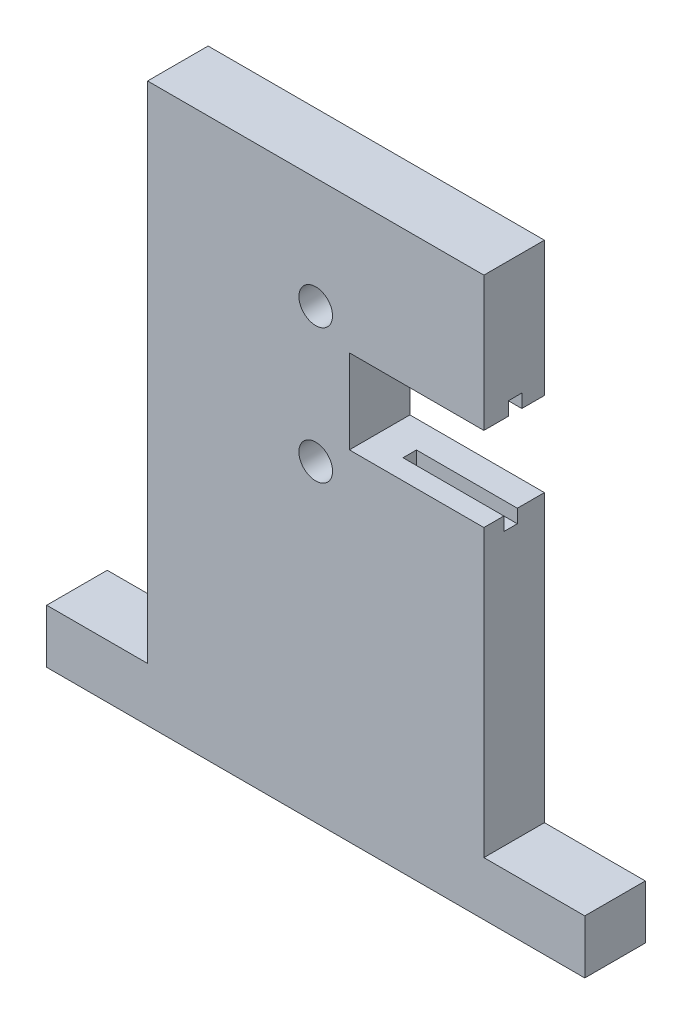
ISO-10303-21;
HEADER;
FILE_DESCRIPTION(('STEP AP214'),'2;1');
FILE_NAME('part.step','',(''),(''),'','','');
FILE_SCHEMA(('AUTOMOTIVE_DESIGN { 1 0 10303 214 1 1 1 1 }'));
ENDSEC;
DATA;
#1=APPLICATION_CONTEXT('core data for automotive mechanical design processes');
#2=APPLICATION_PROTOCOL_DEFINITION('international standard','automotive_design',2000,#1);
#3=PRODUCT_CONTEXT('',#1,'mechanical');
#4=PRODUCT('Part','Part','',(#3));
#5=PRODUCT_RELATED_PRODUCT_CATEGORY('part','',(#4));
#6=PRODUCT_DEFINITION_FORMATION('','',#4);
#7=PRODUCT_DEFINITION_CONTEXT('part definition',#1,'design');
#8=PRODUCT_DEFINITION('design','',#6,#7);
#9=PRODUCT_DEFINITION_SHAPE('','',#8);
#10=(LENGTH_UNIT() NAMED_UNIT(*) SI_UNIT(.MILLI.,.METRE.));
#11=(NAMED_UNIT(*) PLANE_ANGLE_UNIT() SI_UNIT($,.RADIAN.));
#12=(NAMED_UNIT(*) SI_UNIT($,.STERADIAN.) SOLID_ANGLE_UNIT());
#13=UNCERTAINTY_MEASURE_WITH_UNIT(LENGTH_MEASURE(1.E-05),#10,'distance_accuracy_value','');
#14=(GEOMETRIC_REPRESENTATION_CONTEXT(3) GLOBAL_UNCERTAINTY_ASSIGNED_CONTEXT((#13)) GLOBAL_UNIT_ASSIGNED_CONTEXT((#10,
#11,#12)) REPRESENTATION_CONTEXT('',''));
#15=CARTESIAN_POINT('',(0.,0.,0.));
#16=DIRECTION('',(0.,0.,1.));
#17=DIRECTION('',(1.,0.,0.));
#18=AXIS2_PLACEMENT_3D('',#15,#16,#17);
#19=CARTESIAN_POINT('',(66.5532367821157,8.,-9.));
#20=DIRECTION('',(1.,0.,0.));
#21=DIRECTION('',(0.,1.,0.));
#22=AXIS2_PLACEMENT_3D('',#19,#20,#21);
#23=PLANE('',#22);
#24=DIRECTION('',(0.,0.,1.));
#25=VECTOR('',#24,1.);
#26=CARTESIAN_POINT('',(66.5532367821157,63.0000000000001,-9.));
#27=LINE('',#26,#25);
#28=CARTESIAN_POINT('',(66.5532367821157,63.0000000000001,-3.63865081511494));
#29=VERTEX_POINT('',#28);
#30=CARTESIAN_POINT('',(66.5532367821157,63.0000000000001,0.));
#31=VERTEX_POINT('',#30);
#32=EDGE_CURVE('E191',#29,#31,#27,.T.);
#33=ORIENTED_EDGE('',*,*,#32,.F.);
#34=DIRECTION('',(0.,-1.,0.));
#35=VECTOR('',#34,1.);
#36=CARTESIAN_POINT('',(66.5532367821157,65.0000000000001,-3.63865081511494));
#37=LINE('',#36,#35);
#38=CARTESIAN_POINT('',(66.5532367821157,65.0000000000001,-3.63865081511494));
#39=VERTEX_POINT('',#38);
#40=EDGE_CURVE('E185',#39,#29,#37,.T.);
#41=ORIENTED_EDGE('',*,*,#40,.F.);
#42=DIRECTION('',(0.,0.,-1.));
#43=VECTOR('',#42,1.);
#44=CARTESIAN_POINT('',(66.5532367821157,65.0000000000001,-3.63865081511494));
#45=LINE('',#44,#43);
#46=CARTESIAN_POINT('',(66.5532367821157,65.0000000000001,-5.63865081511494));
#47=VERTEX_POINT('',#46);
#48=EDGE_CURVE('E174',#39,#47,#45,.T.);
#49=ORIENTED_EDGE('',*,*,#48,.T.);
#50=DIRECTION('',(0.,-1.,0.));
#51=VECTOR('',#50,1.);
#52=CARTESIAN_POINT('',(66.5532367821157,65.0000000000001,-5.63865081511494));
#53=LINE('',#52,#51);
#54=CARTESIAN_POINT('',(66.5532367821157,63.0000000000001,-5.63865081511494));
#55=VERTEX_POINT('',#54);
#56=EDGE_CURVE('E192',#47,#55,#53,.T.);
#57=ORIENTED_EDGE('',*,*,#56,.T.);
#58=CARTESIAN_POINT('',(66.5532367821157,63.0000000000001,-9.));
#59=VERTEX_POINT('',#58);
#60=EDGE_CURVE('E229',#59,#55,#27,.T.);
#61=ORIENTED_EDGE('',*,*,#60,.F.);
#62=DIRECTION('',(0.,1.,0.));
#63=VECTOR('',#62,1.);
#64=CARTESIAN_POINT('',(66.5532367821157,8.,-9.));
#65=LINE('',#64,#63);
#66=CARTESIAN_POINT('',(66.5532367821157,83.0000000000001,-9.));
#67=VERTEX_POINT('',#66);
#68=EDGE_CURVE('E278',#59,#67,#65,.T.);
#69=ORIENTED_EDGE('',*,*,#68,.T.);
#70=DIRECTION('',(0.,0.,1.));
#71=VECTOR('',#70,1.);
#72=CARTESIAN_POINT('',(66.5532367821157,83.0000000000001,-9.));
#73=LINE('',#72,#71);
#74=CARTESIAN_POINT('',(66.5532367821157,83.0000000000001,0.));
#75=VERTEX_POINT('',#74);
#76=EDGE_CURVE('E317',#67,#75,#73,.T.);
#77=ORIENTED_EDGE('',*,*,#76,.T.);
#78=DIRECTION('',(0.,1.,0.));
#79=VECTOR('',#78,1.);
#80=CARTESIAN_POINT('',(66.5532367821157,8.,0.));
#81=LINE('',#80,#79);
#82=EDGE_CURVE('E302',#31,#75,#81,.T.);
#83=ORIENTED_EDGE('',*,*,#82,.F.);
#84=EDGE_LOOP('',(#33,#41,#49,#57,#61,#69,#77,#83));
#85=FACE_BOUND('',#84,.T.);
#86=ADVANCED_FACE('F33',(#85),#23,.T.);
#87=CARTESIAN_POINT('',(46.5532367821157,63.0000000000001,-9.));
#88=DIRECTION('',(0.,1.,0.));
#89=DIRECTION('',(-1.,0.,0.));
#90=AXIS2_PLACEMENT_3D('',#87,#88,#89);
#91=PLANE('',#90);
#92=DIRECTION('',(1.,0.,0.));
#93=VECTOR('',#92,1.);
#94=CARTESIAN_POINT('',(51.5532367821157,63.0000000000001,-3.63865081511494));
#95=LINE('',#94,#93);
#96=CARTESIAN_POINT('',(51.5532367821157,63.0000000000001,-3.63865081511494));
#97=VERTEX_POINT('',#96);
#98=EDGE_CURVE('E50',#97,#29,#95,.T.);
#99=ORIENTED_EDGE('',*,*,#98,.T.);
#100=ORIENTED_EDGE('',*,*,#32,.T.);
#101=DIRECTION('',(1.,0.,0.));
#102=VECTOR('',#101,1.);
#103=CARTESIAN_POINT('',(46.5532367821157,63.0000000000001,0.));
#104=LINE('',#103,#102);
#105=CARTESIAN_POINT('',(46.5532367821157,63.0000000000001,0.));
#106=VERTEX_POINT('',#105);
#107=EDGE_CURVE('E243',#106,#31,#104,.T.);
#108=ORIENTED_EDGE('',*,*,#107,.F.);
#109=DIRECTION('',(0.,0.,1.));
#110=VECTOR('',#109,1.);
#111=CARTESIAN_POINT('',(46.5532367821157,63.0000000000001,-9.));
#112=LINE('',#111,#110);
#113=CARTESIAN_POINT('',(46.5532367821157,63.0000000000001,-9.));
#114=VERTEX_POINT('',#113);
#115=EDGE_CURVE('E234',#114,#106,#112,.T.);
#116=ORIENTED_EDGE('',*,*,#115,.F.);
#117=DIRECTION('',(1.,0.,0.));
#118=VECTOR('',#117,1.);
#119=CARTESIAN_POINT('',(46.5532367821157,63.0000000000001,-9.));
#120=LINE('',#119,#118);
#121=EDGE_CURVE('E236',#114,#59,#120,.T.);
#122=ORIENTED_EDGE('',*,*,#121,.T.);
#123=ORIENTED_EDGE('',*,*,#60,.T.);
#124=DIRECTION('',(-1.,0.,0.));
#125=VECTOR('',#124,1.);
#126=CARTESIAN_POINT('',(66.5532367821157,63.0000000000001,-5.63865081511494));
#127=LINE('',#126,#125);
#128=CARTESIAN_POINT('',(51.5532367821157,63.0000000000001,-5.63865081511495));
#129=VERTEX_POINT('',#128);
#130=EDGE_CURVE('E369',#55,#129,#127,.T.);
#131=ORIENTED_EDGE('',*,*,#130,.T.);
#132=DIRECTION('',(0.,0.,1.));
#133=VECTOR('',#132,1.);
#134=CARTESIAN_POINT('',(51.5532367821157,63.0000000000001,-5.63865081511495));
#135=LINE('',#134,#133);
#136=EDGE_CURVE('E187',#129,#97,#135,.T.);
#137=ORIENTED_EDGE('',*,*,#136,.T.);
#138=EDGE_LOOP('',(#99,#100,#108,#116,#122,#123,#131,#137));
#139=FACE_BOUND('',#138,.T.);
#140=ADVANCED_FACE('F365',(#139),#91,.F.);
#141=DIRECTION('',(0.,0.,1.));
#142=VECTOR('',#141,1.);
#143=CARTESIAN_POINT('',(66.5532367821157,50.5000000000001,-9.));
#144=LINE('',#143,#142);
#145=CARTESIAN_POINT('',(66.5532367821157,50.5000000000001,-9.));
#146=VERTEX_POINT('',#145);
#147=CARTESIAN_POINT('',(66.5532367821157,50.5000000000001,-4.97376514653536));
#148=VERTEX_POINT('',#147);
#149=EDGE_CURVE('E237',#146,#148,#144,.T.);
#150=ORIENTED_EDGE('',*,*,#149,.T.);
#151=DIRECTION('',(0.,1.,0.));
#152=VECTOR('',#151,1.);
#153=CARTESIAN_POINT('',(66.5532367821157,48.5000000000001,-4.97376514653536));
#154=LINE('',#153,#152);
#155=CARTESIAN_POINT('',(66.5532367821157,48.5000000000001,-4.97376514653536));
#156=VERTEX_POINT('',#155);
#157=EDGE_CURVE('E222',#156,#148,#154,.T.);
#158=ORIENTED_EDGE('',*,*,#157,.F.);
#159=DIRECTION('',(0.,0.,1.));
#160=VECTOR('',#159,1.);
#161=CARTESIAN_POINT('',(66.5532367821157,48.5000000000001,-4.97376514653536));
#162=LINE('',#161,#160);
#163=CARTESIAN_POINT('',(66.5532367821157,48.5000000000001,-2.97376514653536));
#164=VERTEX_POINT('',#163);
#165=EDGE_CURVE('E203',#156,#164,#162,.T.);
#166=ORIENTED_EDGE('',*,*,#165,.T.);
#167=DIRECTION('',(0.,1.,0.));
#168=VECTOR('',#167,1.);
#169=CARTESIAN_POINT('',(66.5532367821157,48.5000000000001,-2.97376514653536));
#170=LINE('',#169,#168);
#171=CARTESIAN_POINT('',(66.5532367821157,50.5000000000001,-2.97376514653536));
#172=VERTEX_POINT('',#171);
#173=EDGE_CURVE('E219',#164,#172,#170,.T.);
#174=ORIENTED_EDGE('',*,*,#173,.T.);
#175=CARTESIAN_POINT('',(66.5532367821157,50.5000000000001,0.));
#176=VERTEX_POINT('',#175);
#177=EDGE_CURVE('E224',#172,#176,#144,.T.);
#178=ORIENTED_EDGE('',*,*,#177,.T.);
#179=CARTESIAN_POINT('',(66.5532367821157,8.,0.));
#180=VERTEX_POINT('',#179);
#181=EDGE_CURVE('E303',#180,#176,#81,.T.);
#182=ORIENTED_EDGE('',*,*,#181,.F.);
#183=DIRECTION('',(0.,0.,1.));
#184=VECTOR('',#183,1.);
#185=CARTESIAN_POINT('',(66.5532367821157,8.,-9.));
#186=LINE('',#185,#184);
#187=CARTESIAN_POINT('',(66.5532367821157,8.,-9.));
#188=VERTEX_POINT('',#187);
#189=EDGE_CURVE('E320',#188,#180,#186,.T.);
#190=ORIENTED_EDGE('',*,*,#189,.F.);
#191=EDGE_CURVE('E279',#188,#146,#65,.T.);
#192=ORIENTED_EDGE('',*,*,#191,.T.);
#193=EDGE_LOOP('',(#150,#158,#166,#174,#178,#182,#190,#192));
#194=FACE_BOUND('',#193,.T.);
#195=ADVANCED_FACE('F353',(#194),#23,.T.);
#196=CARTESIAN_POINT('',(46.5532367821157,50.5000000000001,-9.));
#197=DIRECTION('',(0.,1.,0.));
#198=DIRECTION('',(-1.,0.,0.));
#199=AXIS2_PLACEMENT_3D('',#196,#197,#198);
#200=PLANE('',#199);
#201=DIRECTION('',(0.,0.,-1.));
#202=VECTOR('',#201,1.);
#203=CARTESIAN_POINT('',(51.5532367821157,50.5000000000001,-2.97376514653536));
#204=LINE('',#203,#202);
#205=CARTESIAN_POINT('',(51.5532367821157,50.5000000000001,-2.97376514653536));
#206=VERTEX_POINT('',#205);
#207=CARTESIAN_POINT('',(51.5532367821157,50.5000000000001,-4.97376514653536));
#208=VERTEX_POINT('',#207);
#209=EDGE_CURVE('E204',#206,#208,#204,.T.);
#210=ORIENTED_EDGE('',*,*,#209,.T.);
#211=DIRECTION('',(1.,0.,0.));
#212=VECTOR('',#211,1.);
#213=CARTESIAN_POINT('',(51.5532367821157,50.5000000000001,-4.97376514653536));
#214=LINE('',#213,#212);
#215=EDGE_CURVE('E58',#208,#148,#214,.T.);
#216=ORIENTED_EDGE('',*,*,#215,.T.);
#217=ORIENTED_EDGE('',*,*,#149,.F.);
#218=DIRECTION('',(1.,0.,0.));
#219=VECTOR('',#218,1.);
#220=CARTESIAN_POINT('',(46.5532367821157,50.5000000000001,-9.));
#221=LINE('',#220,#219);
#222=CARTESIAN_POINT('',(46.5532367821157,50.5000000000001,-9.));
#223=VERTEX_POINT('',#222);
#224=EDGE_CURVE('E249',#223,#146,#221,.T.);
#225=ORIENTED_EDGE('',*,*,#224,.F.);
#226=DIRECTION('',(0.,0.,1.));
#227=VECTOR('',#226,1.);
#228=CARTESIAN_POINT('',(46.5532367821157,50.5000000000001,-9.));
#229=LINE('',#228,#227);
#230=CARTESIAN_POINT('',(46.5532367821157,50.5000000000001,0.));
#231=VERTEX_POINT('',#230);
#232=EDGE_CURVE('E228',#223,#231,#229,.T.);
#233=ORIENTED_EDGE('',*,*,#232,.T.);
#234=DIRECTION('',(1.,0.,0.));
#235=VECTOR('',#234,1.);
#236=CARTESIAN_POINT('',(46.5532367821157,50.5000000000001,0.));
#237=LINE('',#236,#235);
#238=EDGE_CURVE('E246',#231,#176,#237,.T.);
#239=ORIENTED_EDGE('',*,*,#238,.T.);
#240=ORIENTED_EDGE('',*,*,#177,.F.);
#241=DIRECTION('',(-1.,0.,0.));
#242=VECTOR('',#241,1.);
#243=CARTESIAN_POINT('',(66.5532367821157,50.5000000000001,-2.97376514653536));
#244=LINE('',#243,#242);
#245=EDGE_CURVE('E194',#172,#206,#244,.T.);
#246=ORIENTED_EDGE('',*,*,#245,.T.);
#247=EDGE_LOOP('',(#210,#216,#217,#225,#233,#239,#240,#246));
#248=FACE_BOUND('',#247,.T.);
#249=ADVANCED_FACE('F356',(#248),#200,.T.);
#250=CARTESIAN_POINT('',(0.,0.,-9.));
#251=DIRECTION('',(0.,0.,1.));
#252=DIRECTION('',(1.,0.,0.));
#253=AXIS2_PLACEMENT_3D('',#250,#251,#252);
#254=PLANE('',#253);
#255=CARTESIAN_POINT('',(41.5532367821157,46.5,-9.));
#256=DIRECTION('',(0.,0.,1.));
#257=DIRECTION('',(1.,0.,0.));
#258=AXIS2_PLACEMENT_3D('',#255,#256,#257);
#259=CIRCLE('',#258,2.5);
#260=CARTESIAN_POINT('',(44.0532367821157,46.5,-9.));
#261=VERTEX_POINT('',#260);
#262=EDGE_CURVE('E259',#261,#261,#259,.T.);
#263=ORIENTED_EDGE('',*,*,#262,.T.);
#264=EDGE_LOOP('',(#263));
#265=FACE_BOUND('',#264,.T.);
#266=CARTESIAN_POINT('',(41.5532367821157,66.5,-9.));
#267=DIRECTION('',(0.,0.,1.));
#268=DIRECTION('',(1.,0.,0.));
#269=AXIS2_PLACEMENT_3D('',#266,#267,#268);
#270=CIRCLE('',#269,2.5);
#271=CARTESIAN_POINT('',(44.0532367821157,66.5,-9.));
#272=VERTEX_POINT('',#271);
#273=EDGE_CURVE('E253',#272,#272,#270,.T.);
#274=ORIENTED_EDGE('',*,*,#273,.T.);
#275=EDGE_LOOP('',(#274));
#276=FACE_BOUND('',#275,.T.);
#277=ORIENTED_EDGE('',*,*,#224,.T.);
#278=ORIENTED_EDGE('',*,*,#191,.F.);
#279=DIRECTION('',(-1.,0.,0.));
#280=VECTOR('',#279,1.);
#281=CARTESIAN_POINT('',(81.5532367821157,8.,-9.));
#282=LINE('',#281,#280);
#283=CARTESIAN_POINT('',(81.5532367821157,8.,-9.));
#284=VERTEX_POINT('',#283);
#285=EDGE_CURVE('E275',#284,#188,#282,.T.);
#286=ORIENTED_EDGE('',*,*,#285,.F.);
#287=DIRECTION('',(0.,1.,0.));
#288=VECTOR('',#287,1.);
#289=CARTESIAN_POINT('',(81.5532367821157,0.,-9.));
#290=LINE('',#289,#288);
#291=CARTESIAN_POINT('',(81.5532367821157,0.,-9.));
#292=VERTEX_POINT('',#291);
#293=EDGE_CURVE('E272',#292,#284,#290,.T.);
#294=ORIENTED_EDGE('',*,*,#293,.F.);
#295=DIRECTION('',(1.,0.,0.));
#296=VECTOR('',#295,1.);
#297=CARTESIAN_POINT('',(1.55323678211589,1.11022302462516E-13,-9.));
#298=LINE('',#297,#296);
#299=CARTESIAN_POINT('',(1.55323678211589,1.11022302462516E-13,-9.));
#300=VERTEX_POINT('',#299);
#301=EDGE_CURVE('E268',#300,#292,#298,.T.);
#302=ORIENTED_EDGE('',*,*,#301,.F.);
#303=DIRECTION('',(0.,-1.,0.));
#304=VECTOR('',#303,1.);
#305=CARTESIAN_POINT('',(1.55323678211588,8.00000000000011,-9.));
#306=LINE('',#305,#304);
#307=CARTESIAN_POINT('',(1.55323678211588,8.00000000000011,-9.));
#308=VERTEX_POINT('',#307);
#309=EDGE_CURVE('E265',#308,#300,#306,.T.);
#310=ORIENTED_EDGE('',*,*,#309,.F.);
#311=DIRECTION('',(-1.,0.,0.));
#312=VECTOR('',#311,1.);
#313=CARTESIAN_POINT('',(16.5532367821159,8.00000000000011,-9.));
#314=LINE('',#313,#312);
#315=CARTESIAN_POINT('',(16.5532367821159,8.00000000000011,-9.));
#316=VERTEX_POINT('',#315);
#317=EDGE_CURVE('E288',#316,#308,#314,.T.);
#318=ORIENTED_EDGE('',*,*,#317,.F.);
#319=DIRECTION('',(0.,-1.,0.));
#320=VECTOR('',#319,1.);
#321=CARTESIAN_POINT('',(16.5532367821159,83.0000000000001,-9.));
#322=LINE('',#321,#320);
#323=CARTESIAN_POINT('',(16.5532367821159,83.0000000000001,-9.));
#324=VERTEX_POINT('',#323);
#325=EDGE_CURVE('E285',#324,#316,#322,.T.);
#326=ORIENTED_EDGE('',*,*,#325,.F.);
#327=DIRECTION('',(-1.,0.,0.));
#328=VECTOR('',#327,1.);
#329=CARTESIAN_POINT('',(66.5532367821157,83.0000000000001,-9.));
#330=LINE('',#329,#328);
#331=EDGE_CURVE('E282',#67,#324,#330,.T.);
#332=ORIENTED_EDGE('',*,*,#331,.F.);
#333=ORIENTED_EDGE('',*,*,#68,.F.);
#334=ORIENTED_EDGE('',*,*,#121,.F.);
#335=DIRECTION('',(0.,-1.,0.));
#336=VECTOR('',#335,1.);
#337=CARTESIAN_POINT('',(46.5532367821157,63.0000000000001,-9.));
#338=LINE('',#337,#336);
#339=EDGE_CURVE('E225',#114,#223,#338,.T.);
#340=ORIENTED_EDGE('',*,*,#339,.T.);
#341=EDGE_LOOP('',(#277,#278,#286,#294,#302,#310,#318,#326,#332,#333,#334,#340));
#342=FACE_BOUND('',#341,.T.);
#343=ADVANCED_FACE('F340',(#265,#276,#342),#254,.F.);
#344=CARTESIAN_POINT('',(0.,0.,0.));
#345=DIRECTION('',(0.,0.,1.));
#346=DIRECTION('',(1.,0.,0.));
#347=AXIS2_PLACEMENT_3D('',#344,#345,#346);
#348=PLANE('',#347);
#349=CARTESIAN_POINT('',(41.5532367821157,46.5,0.));
#350=DIRECTION('',(0.,0.,1.));
#351=DIRECTION('',(1.,0.,0.));
#352=AXIS2_PLACEMENT_3D('',#349,#350,#351);
#353=CIRCLE('',#352,2.5);
#354=CARTESIAN_POINT('',(44.0532367821157,46.5,0.));
#355=VERTEX_POINT('',#354);
#356=EDGE_CURVE('E256',#355,#355,#353,.T.);
#357=ORIENTED_EDGE('',*,*,#356,.F.);
#358=EDGE_LOOP('',(#357));
#359=FACE_BOUND('',#358,.T.);
#360=CARTESIAN_POINT('',(41.5532367821157,66.5,0.));
#361=DIRECTION('',(0.,0.,1.));
#362=DIRECTION('',(1.,0.,0.));
#363=AXIS2_PLACEMENT_3D('',#360,#361,#362);
#364=CIRCLE('',#363,2.5);
#365=CARTESIAN_POINT('',(44.0532367821157,66.5,0.));
#366=VERTEX_POINT('',#365);
#367=EDGE_CURVE('E252',#366,#366,#364,.T.);
#368=ORIENTED_EDGE('',*,*,#367,.F.);
#369=EDGE_LOOP('',(#368));
#370=FACE_BOUND('',#369,.T.);
#371=ORIENTED_EDGE('',*,*,#181,.T.);
#372=ORIENTED_EDGE('',*,*,#238,.F.);
#373=DIRECTION('',(0.,-1.,0.));
#374=VECTOR('',#373,1.);
#375=CARTESIAN_POINT('',(46.5532367821157,63.0000000000001,0.));
#376=LINE('',#375,#374);
#377=EDGE_CURVE('E231',#106,#231,#376,.T.);
#378=ORIENTED_EDGE('',*,*,#377,.F.);
#379=ORIENTED_EDGE('',*,*,#107,.T.);
#380=ORIENTED_EDGE('',*,*,#82,.T.);
#381=DIRECTION('',(-1.,0.,0.));
#382=VECTOR('',#381,1.);
#383=CARTESIAN_POINT('',(66.5532367821157,83.0000000000001,0.));
#384=LINE('',#383,#382);
#385=CARTESIAN_POINT('',(16.5532367821159,83.0000000000001,0.));
#386=VERTEX_POINT('',#385);
#387=EDGE_CURVE('E306',#75,#386,#384,.T.);
#388=ORIENTED_EDGE('',*,*,#387,.T.);
#389=DIRECTION('',(0.,-1.,0.));
#390=VECTOR('',#389,1.);
#391=CARTESIAN_POINT('',(16.5532367821159,83.0000000000001,0.));
#392=LINE('',#391,#390);
#393=CARTESIAN_POINT('',(16.5532367821159,8.00000000000011,0.));
#394=VERTEX_POINT('',#393);
#395=EDGE_CURVE('E309',#386,#394,#392,.T.);
#396=ORIENTED_EDGE('',*,*,#395,.T.);
#397=DIRECTION('',(-1.,0.,0.));
#398=VECTOR('',#397,1.);
#399=CARTESIAN_POINT('',(16.5532367821159,8.00000000000011,0.));
#400=LINE('',#399,#398);
#401=CARTESIAN_POINT('',(1.55323678211588,8.00000000000011,0.));
#402=VERTEX_POINT('',#401);
#403=EDGE_CURVE('E269',#394,#402,#400,.T.);
#404=ORIENTED_EDGE('',*,*,#403,.T.);
#405=DIRECTION('',(0.,-1.,0.));
#406=VECTOR('',#405,1.);
#407=CARTESIAN_POINT('',(1.55323678211588,8.00000000000011,0.));
#408=LINE('',#407,#406);
#409=CARTESIAN_POINT('',(1.55323678211589,1.11022302462516E-13,0.));
#410=VERTEX_POINT('',#409);
#411=EDGE_CURVE('E262',#402,#410,#408,.T.);
#412=ORIENTED_EDGE('',*,*,#411,.T.);
#413=DIRECTION('',(1.,0.,0.));
#414=VECTOR('',#413,1.);
#415=CARTESIAN_POINT('',(1.55323678211589,1.11022302462516E-13,0.));
#416=LINE('',#415,#414);
#417=CARTESIAN_POINT('',(81.5532367821157,0.,0.));
#418=VERTEX_POINT('',#417);
#419=EDGE_CURVE('E293',#410,#418,#416,.T.);
#420=ORIENTED_EDGE('',*,*,#419,.T.);
#421=DIRECTION('',(0.,1.,0.));
#422=VECTOR('',#421,1.);
#423=CARTESIAN_POINT('',(81.5532367821157,0.,0.));
#424=LINE('',#423,#422);
#425=CARTESIAN_POINT('',(81.5532367821157,8.,0.));
#426=VERTEX_POINT('',#425);
#427=EDGE_CURVE('E296',#418,#426,#424,.T.);
#428=ORIENTED_EDGE('',*,*,#427,.T.);
#429=DIRECTION('',(-1.,0.,0.));
#430=VECTOR('',#429,1.);
#431=CARTESIAN_POINT('',(81.5532367821157,8.,0.));
#432=LINE('',#431,#430);
#433=EDGE_CURVE('E299',#426,#180,#432,.T.);
#434=ORIENTED_EDGE('',*,*,#433,.T.);
#435=EDGE_LOOP('',(#371,#372,#378,#379,#380,#388,#396,#404,#412,#420,#428,#434));
#436=FACE_BOUND('',#435,.T.);
#437=ADVANCED_FACE('F333',(#359,#370,#436),#348,.T.);
#438=CARTESIAN_POINT('',(1.55323678211588,8.00000000000011,-9.));
#439=DIRECTION('',(-1.,0.,0.));
#440=DIRECTION('',(0.,-1.,0.));
#441=AXIS2_PLACEMENT_3D('',#438,#439,#440);
#442=PLANE('',#441);
#443=ORIENTED_EDGE('',*,*,#411,.F.);
#444=DIRECTION('',(0.,0.,1.));
#445=VECTOR('',#444,1.);
#446=CARTESIAN_POINT('',(1.55323678211588,8.00000000000011,-9.));
#447=LINE('',#446,#445);
#448=EDGE_CURVE('E11',#308,#402,#447,.T.);
#449=ORIENTED_EDGE('',*,*,#448,.F.);
#450=ORIENTED_EDGE('',*,*,#309,.T.);
#451=DIRECTION('',(0.,0.,1.));
#452=VECTOR('',#451,1.);
#453=CARTESIAN_POINT('',(1.55323678211589,1.11022302462516E-13,-9.));
#454=LINE('',#453,#452);
#455=EDGE_CURVE('E37',#300,#410,#454,.T.);
#456=ORIENTED_EDGE('',*,*,#455,.T.);
#457=EDGE_LOOP('',(#443,#449,#450,#456));
#458=FACE_BOUND('',#457,.T.);
#459=ADVANCED_FACE('F35',(#458),#442,.T.);
#460=CARTESIAN_POINT('',(16.5532367821159,8.00000000000011,-9.));
#461=DIRECTION('',(0.,1.,0.));
#462=DIRECTION('',(-1.,0.,0.));
#463=AXIS2_PLACEMENT_3D('',#460,#461,#462);
#464=PLANE('',#463);
#465=ORIENTED_EDGE('',*,*,#403,.F.);
#466=DIRECTION('',(0.,0.,1.));
#467=VECTOR('',#466,1.);
#468=CARTESIAN_POINT('',(16.5532367821159,8.00000000000011,-9.));
#469=LINE('',#468,#467);
#470=EDGE_CURVE('E42',#316,#394,#469,.T.);
#471=ORIENTED_EDGE('',*,*,#470,.F.);
#472=ORIENTED_EDGE('',*,*,#317,.T.);
#473=ORIENTED_EDGE('',*,*,#448,.T.);
#474=EDGE_LOOP('',(#465,#471,#472,#473));
#475=FACE_BOUND('',#474,.T.);
#476=ADVANCED_FACE('F337',(#475),#464,.T.);
#477=CARTESIAN_POINT('',(16.5532367821159,83.0000000000001,-9.));
#478=DIRECTION('',(-1.,0.,0.));
#479=DIRECTION('',(0.,-1.,0.));
#480=AXIS2_PLACEMENT_3D('',#477,#478,#479);
#481=PLANE('',#480);
#482=ORIENTED_EDGE('',*,*,#395,.F.);
#483=DIRECTION('',(0.,0.,1.));
#484=VECTOR('',#483,1.);
#485=CARTESIAN_POINT('',(16.5532367821159,83.0000000000001,-9.));
#486=LINE('',#485,#484);
#487=EDGE_CURVE('E315',#324,#386,#486,.T.);
#488=ORIENTED_EDGE('',*,*,#487,.F.);
#489=ORIENTED_EDGE('',*,*,#325,.T.);
#490=ORIENTED_EDGE('',*,*,#470,.T.);
#491=EDGE_LOOP('',(#482,#488,#489,#490));
#492=FACE_BOUND('',#491,.T.);
#493=ADVANCED_FACE('F390',(#492),#481,.T.);
#494=CARTESIAN_POINT('',(66.5532367821157,83.0000000000001,-9.));
#495=DIRECTION('',(0.,1.,0.));
#496=DIRECTION('',(-1.,0.,0.));
#497=AXIS2_PLACEMENT_3D('',#494,#495,#496);
#498=PLANE('',#497);
#499=ORIENTED_EDGE('',*,*,#387,.F.);
#500=ORIENTED_EDGE('',*,*,#76,.F.);
#501=ORIENTED_EDGE('',*,*,#331,.T.);
#502=ORIENTED_EDGE('',*,*,#487,.T.);
#503=EDGE_LOOP('',(#499,#500,#501,#502));
#504=FACE_BOUND('',#503,.T.);
#505=ADVANCED_FACE('F388',(#504),#498,.T.);
#506=CARTESIAN_POINT('',(81.5532367821157,8.,-9.));
#507=DIRECTION('',(0.,1.,0.));
#508=DIRECTION('',(-1.,0.,0.));
#509=AXIS2_PLACEMENT_3D('',#506,#507,#508);
#510=PLANE('',#509);
#511=ORIENTED_EDGE('',*,*,#433,.F.);
#512=DIRECTION('',(0.,0.,1.));
#513=VECTOR('',#512,1.);
#514=CARTESIAN_POINT('',(81.5532367821157,8.,-9.));
#515=LINE('',#514,#513);
#516=EDGE_CURVE('E322',#284,#426,#515,.T.);
#517=ORIENTED_EDGE('',*,*,#516,.F.);
#518=ORIENTED_EDGE('',*,*,#285,.T.);
#519=ORIENTED_EDGE('',*,*,#189,.T.);
#520=EDGE_LOOP('',(#511,#517,#518,#519));
#521=FACE_BOUND('',#520,.T.);
#522=ADVANCED_FACE('F351',(#521),#510,.T.);
#523=CARTESIAN_POINT('',(81.5532367821157,0.,-9.));
#524=DIRECTION('',(1.,0.,0.));
#525=DIRECTION('',(0.,0.,-1.));
#526=AXIS2_PLACEMENT_3D('',#523,#524,#525);
#527=PLANE('',#526);
#528=ORIENTED_EDGE('',*,*,#427,.F.);
#529=DIRECTION('',(0.,0.,1.));
#530=VECTOR('',#529,1.);
#531=CARTESIAN_POINT('',(81.5532367821157,0.,-9.));
#532=LINE('',#531,#530);
#533=EDGE_CURVE('E323',#292,#418,#532,.T.);
#534=ORIENTED_EDGE('',*,*,#533,.F.);
#535=ORIENTED_EDGE('',*,*,#293,.T.);
#536=ORIENTED_EDGE('',*,*,#516,.T.);
#537=EDGE_LOOP('',(#528,#534,#535,#536));
#538=FACE_BOUND('',#537,.T.);
#539=ADVANCED_FACE('F346',(#538),#527,.T.);
#540=CARTESIAN_POINT('',(1.55323678211589,1.11022302462516E-13,-9.));
#541=DIRECTION('',(0.,-1.,0.));
#542=DIRECTION('',(1.,0.,0.));
#543=AXIS2_PLACEMENT_3D('',#540,#541,#542);
#544=PLANE('',#543);
#545=ORIENTED_EDGE('',*,*,#419,.F.);
#546=ORIENTED_EDGE('',*,*,#455,.F.);
#547=ORIENTED_EDGE('',*,*,#301,.T.);
#548=ORIENTED_EDGE('',*,*,#533,.T.);
#549=EDGE_LOOP('',(#545,#546,#547,#548));
#550=FACE_BOUND('',#549,.T.);
#551=ADVANCED_FACE('F331',(#550),#544,.T.);
#552=CARTESIAN_POINT('',(41.5532367821157,46.5,-9.));
#553=DIRECTION('',(0.,0.,1.));
#554=DIRECTION('',(1.,0.,0.));
#555=AXIS2_PLACEMENT_3D('',#552,#553,#554);
#556=CYLINDRICAL_SURFACE('',#555,2.5);
#557=ORIENTED_EDGE('',*,*,#262,.F.);
#558=EDGE_LOOP('',(#557));
#559=FACE_BOUND('',#558,.T.);
#560=ORIENTED_EDGE('',*,*,#356,.T.);
#561=EDGE_LOOP('',(#560));
#562=FACE_BOUND('',#561,.T.);
#563=ADVANCED_FACE('F421',(#559,#562),#556,.F.);
#564=CARTESIAN_POINT('',(41.5532367821157,66.5,-9.));
#565=DIRECTION('',(0.,0.,1.));
#566=DIRECTION('',(1.,0.,0.));
#567=AXIS2_PLACEMENT_3D('',#564,#565,#566);
#568=CYLINDRICAL_SURFACE('',#567,2.5);
#569=ORIENTED_EDGE('',*,*,#273,.F.);
#570=EDGE_LOOP('',(#569));
#571=FACE_BOUND('',#570,.T.);
#572=ORIENTED_EDGE('',*,*,#367,.T.);
#573=EDGE_LOOP('',(#572));
#574=FACE_BOUND('',#573,.T.);
#575=ADVANCED_FACE('F418',(#571,#574),#568,.F.);
#576=CARTESIAN_POINT('',(46.5532367821157,0.,0.));
#577=DIRECTION('',(-1.,0.,0.));
#578=DIRECTION('',(0.,0.,1.));
#579=AXIS2_PLACEMENT_3D('',#576,#577,#578);
#580=PLANE('',#579);
#581=ORIENTED_EDGE('',*,*,#339,.F.);
#582=ORIENTED_EDGE('',*,*,#115,.T.);
#583=ORIENTED_EDGE('',*,*,#377,.T.);
#584=ORIENTED_EDGE('',*,*,#232,.F.);
#585=EDGE_LOOP('',(#581,#582,#583,#584));
#586=FACE_BOUND('',#585,.T.);
#587=ADVANCED_FACE('F361',(#586),#580,.F.);
#588=CARTESIAN_POINT('',(51.5532367821157,48.5000000000001,-4.97376514653536));
#589=DIRECTION('',(0.,0.,1.));
#590=DIRECTION('',(1.,0.,0.));
#591=AXIS2_PLACEMENT_3D('',#588,#589,#590);
#592=PLANE('',#591);
#593=ORIENTED_EDGE('',*,*,#215,.F.);
#594=DIRECTION('',(0.,1.,0.));
#595=VECTOR('',#594,1.);
#596=CARTESIAN_POINT('',(51.5532367821157,48.5000000000001,-4.97376514653536));
#597=LINE('',#596,#595);
#598=CARTESIAN_POINT('',(51.5532367821157,48.5000000000001,-4.97376514653536));
#599=VERTEX_POINT('',#598);
#600=EDGE_CURVE('E210',#599,#208,#597,.T.);
#601=ORIENTED_EDGE('',*,*,#600,.F.);
#602=DIRECTION('',(1.,0.,0.));
#603=VECTOR('',#602,1.);
#604=CARTESIAN_POINT('',(51.5532367821157,48.5000000000001,-4.97376514653536));
#605=LINE('',#604,#603);
#606=EDGE_CURVE('E200',#599,#156,#605,.T.);
#607=ORIENTED_EDGE('',*,*,#606,.T.);
#608=ORIENTED_EDGE('',*,*,#157,.T.);
#609=EDGE_LOOP('',(#593,#601,#607,#608));
#610=FACE_BOUND('',#609,.T.);
#611=ADVANCED_FACE('F504',(#610),#592,.T.);
#612=CARTESIAN_POINT('',(66.5532367821157,48.5000000000001,-2.97376514653536));
#613=DIRECTION('',(0.,0.,-1.));
#614=DIRECTION('',(-1.,0.,0.));
#615=AXIS2_PLACEMENT_3D('',#612,#613,#614);
#616=PLANE('',#615);
#617=ORIENTED_EDGE('',*,*,#245,.F.);
#618=ORIENTED_EDGE('',*,*,#173,.F.);
#619=DIRECTION('',(-1.,0.,0.));
#620=VECTOR('',#619,1.);
#621=CARTESIAN_POINT('',(66.5532367821157,48.5000000000001,-2.97376514653536));
#622=LINE('',#621,#620);
#623=CARTESIAN_POINT('',(51.5532367821157,48.5000000000001,-2.97376514653536));
#624=VERTEX_POINT('',#623);
#625=EDGE_CURVE('E207',#164,#624,#622,.T.);
#626=ORIENTED_EDGE('',*,*,#625,.T.);
#627=DIRECTION('',(0.,1.,0.));
#628=VECTOR('',#627,1.);
#629=CARTESIAN_POINT('',(51.5532367821157,48.5000000000001,-2.97376514653536));
#630=LINE('',#629,#628);
#631=EDGE_CURVE('E217',#624,#206,#630,.T.);
#632=ORIENTED_EDGE('',*,*,#631,.T.);
#633=EDGE_LOOP('',(#617,#618,#626,#632));
#634=FACE_BOUND('',#633,.T.);
#635=ADVANCED_FACE('F521',(#634),#616,.T.);
#636=CARTESIAN_POINT('',(51.5532367821157,48.5000000000001,-2.97376514653536));
#637=DIRECTION('',(1.,0.,0.));
#638=DIRECTION('',(0.,1.,0.));
#639=AXIS2_PLACEMENT_3D('',#636,#637,#638);
#640=PLANE('',#639);
#641=ORIENTED_EDGE('',*,*,#209,.F.);
#642=ORIENTED_EDGE('',*,*,#631,.F.);
#643=DIRECTION('',(0.,0.,-1.));
#644=VECTOR('',#643,1.);
#645=CARTESIAN_POINT('',(51.5532367821157,48.5000000000001,-2.97376514653536));
#646=LINE('',#645,#644);
#647=EDGE_CURVE('E209',#624,#599,#646,.T.);
#648=ORIENTED_EDGE('',*,*,#647,.T.);
#649=ORIENTED_EDGE('',*,*,#600,.T.);
#650=EDGE_LOOP('',(#641,#642,#648,#649));
#651=FACE_BOUND('',#650,.T.);
#652=ADVANCED_FACE('F530',(#651),#640,.T.);
#653=CARTESIAN_POINT('',(0.,48.5000000000001,0.));
#654=DIRECTION('',(0.,-1.,0.));
#655=DIRECTION('',(1.,0.,0.));
#656=AXIS2_PLACEMENT_3D('',#653,#654,#655);
#657=PLANE('',#656);
#658=ORIENTED_EDGE('',*,*,#606,.F.);
#659=ORIENTED_EDGE('',*,*,#647,.F.);
#660=ORIENTED_EDGE('',*,*,#625,.F.);
#661=ORIENTED_EDGE('',*,*,#165,.F.);
#662=EDGE_LOOP('',(#658,#659,#660,#661));
#663=FACE_BOUND('',#662,.T.);
#664=ADVANCED_FACE('F540',(#663),#657,.F.);
#665=CARTESIAN_POINT('',(51.5532367821157,65.0000000000001,-3.63865081511494));
#666=DIRECTION('',(0.,0.,-1.));
#667=DIRECTION('',(-1.,0.,0.));
#668=AXIS2_PLACEMENT_3D('',#665,#666,#667);
#669=PLANE('',#668);
#670=ORIENTED_EDGE('',*,*,#98,.F.);
#671=DIRECTION('',(0.,-1.,0.));
#672=VECTOR('',#671,1.);
#673=CARTESIAN_POINT('',(51.5532367821157,65.0000000000001,-3.63865081511494));
#674=LINE('',#673,#672);
#675=CARTESIAN_POINT('',(51.5532367821157,65.0000000000001,-3.63865081511494));
#676=VERTEX_POINT('',#675);
#677=EDGE_CURVE('E186',#676,#97,#674,.T.);
#678=ORIENTED_EDGE('',*,*,#677,.F.);
#679=DIRECTION('',(1.,0.,0.));
#680=VECTOR('',#679,1.);
#681=CARTESIAN_POINT('',(51.5532367821157,65.0000000000001,-3.63865081511494));
#682=LINE('',#681,#680);
#683=EDGE_CURVE('E178',#676,#39,#682,.T.);
#684=ORIENTED_EDGE('',*,*,#683,.T.);
#685=ORIENTED_EDGE('',*,*,#40,.T.);
#686=EDGE_LOOP('',(#670,#678,#684,#685));
#687=FACE_BOUND('',#686,.T.);
#688=ADVANCED_FACE('F184',(#687),#669,.T.);
#689=CARTESIAN_POINT('',(66.5532367821157,65.0000000000001,-5.63865081511494));
#690=DIRECTION('',(0.,0.,1.));
#691=DIRECTION('',(1.,0.,0.));
#692=AXIS2_PLACEMENT_3D('',#689,#690,#691);
#693=PLANE('',#692);
#694=ORIENTED_EDGE('',*,*,#130,.F.);
#695=ORIENTED_EDGE('',*,*,#56,.F.);
#696=DIRECTION('',(-1.,0.,0.));
#697=VECTOR('',#696,1.);
#698=CARTESIAN_POINT('',(66.5532367821157,65.0000000000001,-5.63865081511494));
#699=LINE('',#698,#697);
#700=CARTESIAN_POINT('',(51.5532367821157,65.0000000000001,-5.63865081511495));
#701=VERTEX_POINT('',#700);
#702=EDGE_CURVE('E179',#47,#701,#699,.T.);
#703=ORIENTED_EDGE('',*,*,#702,.T.);
#704=DIRECTION('',(0.,-1.,0.));
#705=VECTOR('',#704,1.);
#706=CARTESIAN_POINT('',(51.5532367821157,65.0000000000001,-5.63865081511495));
#707=LINE('',#706,#705);
#708=EDGE_CURVE('E196',#701,#129,#707,.T.);
#709=ORIENTED_EDGE('',*,*,#708,.T.);
#710=EDGE_LOOP('',(#694,#695,#703,#709));
#711=FACE_BOUND('',#710,.T.);
#712=ADVANCED_FACE('F379',(#711),#693,.T.);
#713=CARTESIAN_POINT('',(51.5532367821157,65.0000000000001,-5.63865081511495));
#714=DIRECTION('',(1.,0.,0.));
#715=DIRECTION('',(0.,1.,0.));
#716=AXIS2_PLACEMENT_3D('',#713,#714,#715);
#717=PLANE('',#716);
#718=ORIENTED_EDGE('',*,*,#136,.F.);
#719=ORIENTED_EDGE('',*,*,#708,.F.);
#720=DIRECTION('',(0.,0.,1.));
#721=VECTOR('',#720,1.);
#722=CARTESIAN_POINT('',(51.5532367821157,65.0000000000001,-5.63865081511495));
#723=LINE('',#722,#721);
#724=EDGE_CURVE('E373',#701,#676,#723,.T.);
#725=ORIENTED_EDGE('',*,*,#724,.T.);
#726=ORIENTED_EDGE('',*,*,#677,.T.);
#727=EDGE_LOOP('',(#718,#719,#725,#726));
#728=FACE_BOUND('',#727,.T.);
#729=ADVANCED_FACE('F381',(#728),#717,.T.);
#730=CARTESIAN_POINT('',(0.,65.0000000000001,0.));
#731=DIRECTION('',(0.,1.,0.));
#732=DIRECTION('',(0.,0.,1.));
#733=AXIS2_PLACEMENT_3D('',#730,#731,#732);
#734=PLANE('',#733);
#735=ORIENTED_EDGE('',*,*,#683,.F.);
#736=ORIENTED_EDGE('',*,*,#724,.F.);
#737=ORIENTED_EDGE('',*,*,#702,.F.);
#738=ORIENTED_EDGE('',*,*,#48,.F.);
#739=EDGE_LOOP('',(#735,#736,#737,#738));
#740=FACE_BOUND('',#739,.T.);
#741=ADVANCED_FACE('F176',(#740),#734,.F.);
#742=CLOSED_SHELL('',(#86,#140,#195,#249,#343,#437,#459,#476,#493,#505,#522,#539,#551,#563,#575,
#587,#611,#635,#652,#664,#688,#712,#729,#741));
#743=MANIFOLD_SOLID_BREP('B2',#742);
#744=ADVANCED_BREP_SHAPE_REPRESENTATION('',(#18,#743),#14);
#745=SHAPE_DEFINITION_REPRESENTATION(#9,#744);
ENDSEC;
END-ISO-10303-21;
